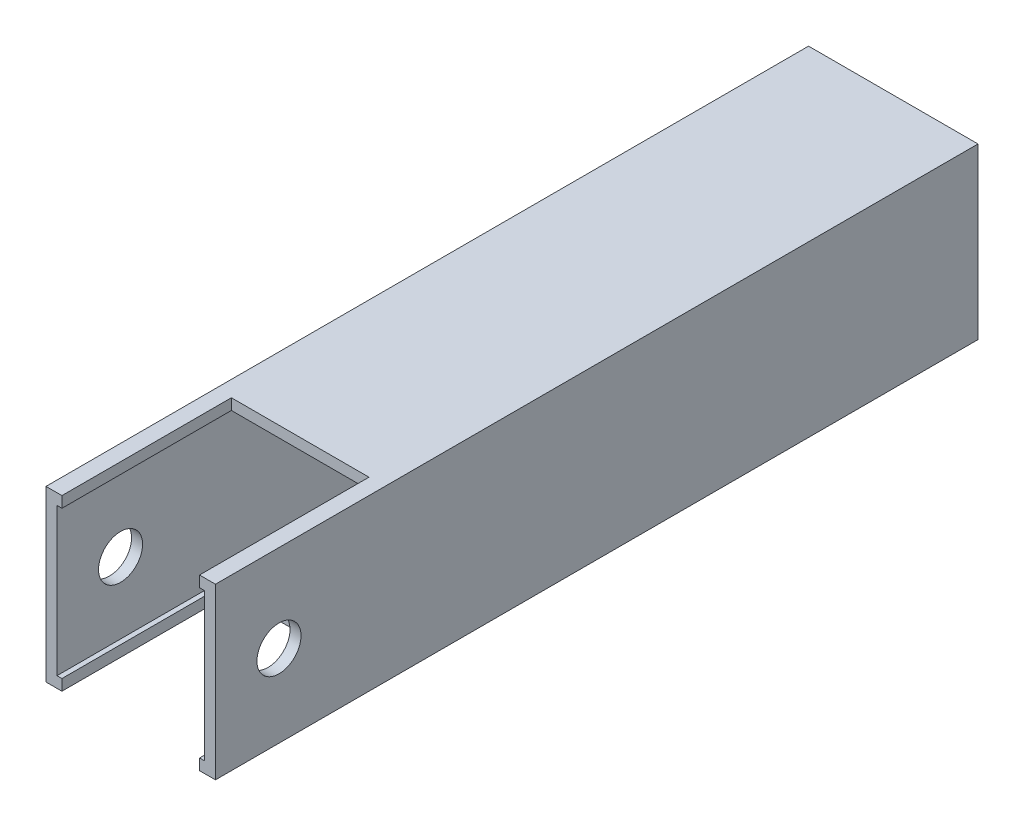
ISO-10303-21;
HEADER;
FILE_DESCRIPTION(('STEP AP214'),'2;1');
FILE_NAME('part.step','',(''),(''),'','','');
FILE_SCHEMA(('AUTOMOTIVE_DESIGN { 1 0 10303 214 1 1 1 1 }'));
ENDSEC;
DATA;
#1=APPLICATION_CONTEXT('core data for automotive mechanical design processes');
#2=APPLICATION_PROTOCOL_DEFINITION('international standard','automotive_design',2000,#1);
#3=PRODUCT_CONTEXT('',#1,'mechanical');
#4=PRODUCT('Part','Part','',(#3));
#5=PRODUCT_RELATED_PRODUCT_CATEGORY('part','',(#4));
#6=PRODUCT_DEFINITION_FORMATION('','',#4);
#7=PRODUCT_DEFINITION_CONTEXT('part definition',#1,'design');
#8=PRODUCT_DEFINITION('design','',#6,#7);
#9=PRODUCT_DEFINITION_SHAPE('','',#8);
#10=(LENGTH_UNIT() NAMED_UNIT(*) SI_UNIT(.MILLI.,.METRE.));
#11=(NAMED_UNIT(*) PLANE_ANGLE_UNIT() SI_UNIT($,.RADIAN.));
#12=(NAMED_UNIT(*) SI_UNIT($,.STERADIAN.) SOLID_ANGLE_UNIT());
#13=UNCERTAINTY_MEASURE_WITH_UNIT(LENGTH_MEASURE(1.E-05),#10,'distance_accuracy_value','');
#14=(GEOMETRIC_REPRESENTATION_CONTEXT(3) GLOBAL_UNCERTAINTY_ASSIGNED_CONTEXT((#13)) GLOBAL_UNIT_ASSIGNED_CONTEXT((#10,
#11,#12)) REPRESENTATION_CONTEXT('',''));
#15=CARTESIAN_POINT('',(0.,0.,0.));
#16=DIRECTION('',(0.,0.,1.));
#17=DIRECTION('',(1.,0.,0.));
#18=AXIS2_PLACEMENT_3D('',#15,#16,#17);
#19=CARTESIAN_POINT('',(0.,0.,114.3));
#20=DIRECTION('',(0.,0.,-1.));
#21=DIRECTION('',(-1.,0.,0.));
#22=AXIS2_PLACEMENT_3D('',#19,#20,#21);
#23=PLANE('',#22);
#24=DIRECTION('',(0.,-1.,0.));
#25=VECTOR('',#24,1.);
#26=CARTESIAN_POINT('',(-48.8937636693543,0.,114.3));
#27=LINE('',#26,#25);
#28=CARTESIAN_POINT('',(-48.8937636693543,-5.95052836207922,114.3));
#29=VERTEX_POINT('',#28);
#30=CARTESIAN_POINT('',(-48.8937636693543,-7.60152836207922,114.3));
#31=VERTEX_POINT('',#30);
#32=EDGE_CURVE('E56',#29,#31,#27,.T.);
#33=ORIENTED_EDGE('',*,*,#32,.F.);
#34=DIRECTION('',(-1.,0.,0.));
#35=VECTOR('',#34,1.);
#36=CARTESIAN_POINT('',(-51.2813636693543,-5.95052836207922,114.3));
#37=LINE('',#36,#35);
#38=CARTESIAN_POINT('',(-51.2813636693543,-5.95052836207922,114.3));
#39=VERTEX_POINT('',#38);
#40=EDGE_CURVE('E241',#29,#39,#37,.T.);
#41=ORIENTED_EDGE('',*,*,#40,.T.);
#42=DIRECTION('',(0.,-1.,0.));
#43=VECTOR('',#42,1.);
#44=CARTESIAN_POINT('',(-51.2813636693543,-31.3505283620792,114.3));
#45=LINE('',#44,#43);
#46=CARTESIAN_POINT('',(-51.2813636693543,-31.3505283620792,114.3));
#47=VERTEX_POINT('',#46);
#48=EDGE_CURVE('E232',#39,#47,#45,.T.);
#49=ORIENTED_EDGE('',*,*,#48,.T.);
#50=DIRECTION('',(1.,0.,0.));
#51=VECTOR('',#50,1.);
#52=CARTESIAN_POINT('',(-51.2813636693543,-31.3505283620792,114.3));
#53=LINE('',#52,#51);
#54=CARTESIAN_POINT('',(-48.8937636693543,-31.3505283620792,114.3));
#55=VERTEX_POINT('',#54);
#56=EDGE_CURVE('E236',#47,#55,#53,.T.);
#57=ORIENTED_EDGE('',*,*,#56,.T.);
#58=CARTESIAN_POINT('',(-48.8937636693543,-29.6995283620792,114.3));
#59=VERTEX_POINT('',#58);
#60=EDGE_CURVE('E186',#59,#55,#27,.T.);
#61=ORIENTED_EDGE('',*,*,#60,.F.);
#62=DIRECTION('',(1.,0.,0.));
#63=VECTOR('',#62,1.);
#64=CARTESIAN_POINT('',(-49.6303636693543,-29.6995283620792,114.3));
#65=LINE('',#64,#63);
#66=CARTESIAN_POINT('',(-49.6303636693543,-29.6995283620792,114.3));
#67=VERTEX_POINT('',#66);
#68=EDGE_CURVE('E200',#67,#59,#65,.T.);
#69=ORIENTED_EDGE('',*,*,#68,.F.);
#70=DIRECTION('',(0.,-1.,0.));
#71=VECTOR('',#70,1.);
#72=CARTESIAN_POINT('',(-49.6303636693543,-7.60152836207922,114.3));
#73=LINE('',#72,#71);
#74=CARTESIAN_POINT('',(-49.6303636693543,-7.60152836207922,114.3));
#75=VERTEX_POINT('',#74);
#76=EDGE_CURVE('E215',#75,#67,#73,.T.);
#77=ORIENTED_EDGE('',*,*,#76,.F.);
#78=DIRECTION('',(-1.,0.,0.));
#79=VECTOR('',#78,1.);
#80=CARTESIAN_POINT('',(-49.6303636693543,-7.60152836207922,114.3));
#81=LINE('',#80,#79);
#82=EDGE_CURVE('E211',#31,#75,#81,.T.);
#83=ORIENTED_EDGE('',*,*,#82,.F.);
#84=EDGE_LOOP('',(#33,#41,#49,#57,#61,#69,#77,#83));
#85=FACE_BOUND('',#84,.T.);
#86=ADVANCED_FACE('F32',(#85),#23,.F.);
#87=CARTESIAN_POINT('',(-51.2813636693543,-31.3505283620792,114.3));
#88=DIRECTION('',(1.,0.,0.));
#89=DIRECTION('',(0.,0.,-1.));
#90=AXIS2_PLACEMENT_3D('',#87,#88,#89);
#91=PLANE('',#90);
#92=CARTESIAN_POINT('',(-51.2813636693543,-19.0445855896719,104.775));
#93=DIRECTION('',(-1.,0.,0.));
#94=DIRECTION('',(0.,0.,1.));
#95=AXIS2_PLACEMENT_3D('',#92,#93,#94);
#96=CIRCLE('',#95,3.302);
#97=CARTESIAN_POINT('',(-51.2813636693543,-19.0445855896719,108.077));
#98=VERTEX_POINT('',#97);
#99=EDGE_CURVE('E410',#98,#98,#96,.T.);
#100=ORIENTED_EDGE('',*,*,#99,.F.);
#101=EDGE_LOOP('',(#100));
#102=FACE_BOUND('',#101,.T.);
#103=DIRECTION('',(0.,-1.,0.));
#104=VECTOR('',#103,1.);
#105=CARTESIAN_POINT('',(-51.2813636693543,-31.3505283620792,0.));
#106=LINE('',#105,#104);
#107=CARTESIAN_POINT('',(-51.2813636693543,-5.95052836207922,0.));
#108=VERTEX_POINT('',#107);
#109=CARTESIAN_POINT('',(-51.2813636693543,-31.3505283620792,0.));
#110=VERTEX_POINT('',#109);
#111=EDGE_CURVE('E224',#108,#110,#106,.T.);
#112=ORIENTED_EDGE('',*,*,#111,.T.);
#113=DIRECTION('',(0.,0.,-1.));
#114=VECTOR('',#113,1.);
#115=CARTESIAN_POINT('',(-51.2813636693543,-31.3505283620792,114.3));
#116=LINE('',#115,#114);
#117=EDGE_CURVE('E261',#47,#110,#116,.T.);
#118=ORIENTED_EDGE('',*,*,#117,.F.);
#119=ORIENTED_EDGE('',*,*,#48,.F.);
#120=DIRECTION('',(0.,0.,-1.));
#121=VECTOR('',#120,1.);
#122=CARTESIAN_POINT('',(-51.2813636693543,-5.95052836207922,114.3));
#123=LINE('',#122,#121);
#124=EDGE_CURVE('E245',#39,#108,#123,.T.);
#125=ORIENTED_EDGE('',*,*,#124,.T.);
#126=EDGE_LOOP('',(#112,#118,#119,#125));
#127=FACE_BOUND('',#126,.T.);
#128=ADVANCED_FACE('F34',(#102,#127),#91,.F.);
#129=CARTESIAN_POINT('',(-51.2813636693543,-31.3505283620792,114.3));
#130=DIRECTION('',(0.,1.,0.));
#131=DIRECTION('',(0.,0.,1.));
#132=AXIS2_PLACEMENT_3D('',#129,#130,#131);
#133=PLANE('',#132);
#134=CARTESIAN_POINT('',(-28.2689636693543,-31.3505283620792,114.3));
#135=VERTEX_POINT('',#134);
#136=CARTESIAN_POINT('',(-25.8813636693543,-31.3505283620792,114.3));
#137=VERTEX_POINT('',#136);
#138=EDGE_CURVE('E167',#135,#137,#53,.T.);
#139=ORIENTED_EDGE('',*,*,#138,.F.);
#140=DIRECTION('',(0.,0.,-1.));
#141=VECTOR('',#140,1.);
#142=CARTESIAN_POINT('',(-28.2689636693543,-31.3505283620792,139.7));
#143=LINE('',#142,#141);
#144=CARTESIAN_POINT('',(-28.2689636693543,-31.3505283620792,88.9));
#145=VERTEX_POINT('',#144);
#146=EDGE_CURVE('E154',#135,#145,#143,.T.);
#147=ORIENTED_EDGE('',*,*,#146,.T.);
#148=DIRECTION('',(1.,0.,0.));
#149=VECTOR('',#148,1.);
#150=CARTESIAN_POINT('',(-48.8937636693543,-31.3505283620792,88.9));
#151=LINE('',#150,#149);
#152=CARTESIAN_POINT('',(-48.8937636693543,-31.3505283620792,88.9));
#153=VERTEX_POINT('',#152);
#154=EDGE_CURVE('E146',#153,#145,#151,.T.);
#155=ORIENTED_EDGE('',*,*,#154,.F.);
#156=DIRECTION('',(0.,0.,-1.));
#157=VECTOR('',#156,1.);
#158=CARTESIAN_POINT('',(-48.8937636693543,-31.3505283620792,139.7));
#159=LINE('',#158,#157);
#160=EDGE_CURVE('E168',#55,#153,#159,.T.);
#161=ORIENTED_EDGE('',*,*,#160,.F.);
#162=ORIENTED_EDGE('',*,*,#56,.F.);
#163=ORIENTED_EDGE('',*,*,#117,.T.);
#164=DIRECTION('',(1.,0.,0.));
#165=VECTOR('',#164,1.);
#166=CARTESIAN_POINT('',(-51.2813636693543,-31.3505283620792,0.));
#167=LINE('',#166,#165);
#168=CARTESIAN_POINT('',(-25.8813636693543,-31.3505283620792,0.));
#169=VERTEX_POINT('',#168);
#170=EDGE_CURVE('E248',#110,#169,#167,.T.);
#171=ORIENTED_EDGE('',*,*,#170,.T.);
#172=DIRECTION('',(0.,0.,-1.));
#173=VECTOR('',#172,1.);
#174=CARTESIAN_POINT('',(-25.8813636693543,-31.3505283620792,114.3));
#175=LINE('',#174,#173);
#176=EDGE_CURVE('E258',#137,#169,#175,.T.);
#177=ORIENTED_EDGE('',*,*,#176,.F.);
#178=EDGE_LOOP('',(#139,#147,#155,#161,#162,#163,#171,#177));
#179=FACE_BOUND('',#178,.T.);
#180=ADVANCED_FACE('F165',(#179),#133,.F.);
#181=CARTESIAN_POINT('',(-25.8813636693543,-31.3505283620792,114.3));
#182=DIRECTION('',(-1.,0.,0.));
#183=DIRECTION('',(0.,0.,1.));
#184=AXIS2_PLACEMENT_3D('',#181,#182,#183);
#185=PLANE('',#184);
#186=CARTESIAN_POINT('',(-25.8813636693543,-19.0445855896719,104.775));
#187=DIRECTION('',(-1.,0.,0.));
#188=DIRECTION('',(0.,0.,1.));
#189=AXIS2_PLACEMENT_3D('',#186,#187,#188);
#190=CIRCLE('',#189,3.302);
#191=CARTESIAN_POINT('',(-25.8813636693543,-19.0445855896719,108.077));
#192=VERTEX_POINT('',#191);
#193=EDGE_CURVE('E405',#192,#192,#190,.T.);
#194=ORIENTED_EDGE('',*,*,#193,.T.);
#195=EDGE_LOOP('',(#194));
#196=FACE_BOUND('',#195,.T.);
#197=DIRECTION('',(0.,1.,0.));
#198=VECTOR('',#197,1.);
#199=CARTESIAN_POINT('',(-25.8813636693543,-31.3505283620792,0.));
#200=LINE('',#199,#198);
#201=CARTESIAN_POINT('',(-25.8813636693543,-5.95052836207922,0.));
#202=VERTEX_POINT('',#201);
#203=EDGE_CURVE('E250',#169,#202,#200,.T.);
#204=ORIENTED_EDGE('',*,*,#203,.T.);
#205=DIRECTION('',(0.,0.,-1.));
#206=VECTOR('',#205,1.);
#207=CARTESIAN_POINT('',(-25.8813636693543,-5.95052836207922,114.3));
#208=LINE('',#207,#206);
#209=CARTESIAN_POINT('',(-25.8813636693543,-5.95052836207922,114.3));
#210=VERTEX_POINT('',#209);
#211=EDGE_CURVE('E255',#210,#202,#208,.T.);
#212=ORIENTED_EDGE('',*,*,#211,.F.);
#213=DIRECTION('',(0.,1.,0.));
#214=VECTOR('',#213,1.);
#215=CARTESIAN_POINT('',(-25.8813636693543,-31.3505283620792,114.3));
#216=LINE('',#215,#214);
#217=EDGE_CURVE('E239',#137,#210,#216,.T.);
#218=ORIENTED_EDGE('',*,*,#217,.F.);
#219=ORIENTED_EDGE('',*,*,#176,.T.);
#220=EDGE_LOOP('',(#204,#212,#218,#219));
#221=FACE_BOUND('',#220,.T.);
#222=ADVANCED_FACE('F309',(#196,#221),#185,.F.);
#223=CARTESIAN_POINT('',(-51.2813636693543,-5.95052836207922,114.3));
#224=DIRECTION('',(0.,-1.,0.));
#225=DIRECTION('',(0.,0.,-1.));
#226=AXIS2_PLACEMENT_3D('',#223,#224,#225);
#227=PLANE('',#226);
#228=DIRECTION('',(1.,0.,0.));
#229=VECTOR('',#228,1.);
#230=CARTESIAN_POINT('',(-48.8937636693543,-5.95052836207922,88.9));
#231=LINE('',#230,#229);
#232=CARTESIAN_POINT('',(-48.8937636693543,-5.95052836207922,88.9));
#233=VERTEX_POINT('',#232);
#234=CARTESIAN_POINT('',(-28.2689636693543,-5.95052836207922,88.9));
#235=VERTEX_POINT('',#234);
#236=EDGE_CURVE('E174',#233,#235,#231,.T.);
#237=ORIENTED_EDGE('',*,*,#236,.T.);
#238=DIRECTION('',(0.,0.,-1.));
#239=VECTOR('',#238,1.);
#240=CARTESIAN_POINT('',(-28.2689636693543,-5.95052836207922,139.7));
#241=LINE('',#240,#239);
#242=CARTESIAN_POINT('',(-28.2689636693543,-5.95052836207922,114.3));
#243=VERTEX_POINT('',#242);
#244=EDGE_CURVE('E177',#243,#235,#241,.T.);
#245=ORIENTED_EDGE('',*,*,#244,.F.);
#246=EDGE_CURVE('E242',#210,#243,#37,.T.);
#247=ORIENTED_EDGE('',*,*,#246,.F.);
#248=ORIENTED_EDGE('',*,*,#211,.T.);
#249=DIRECTION('',(-1.,0.,0.));
#250=VECTOR('',#249,1.);
#251=CARTESIAN_POINT('',(-51.2813636693543,-5.95052836207922,0.));
#252=LINE('',#251,#250);
#253=EDGE_CURVE('E235',#202,#108,#252,.T.);
#254=ORIENTED_EDGE('',*,*,#253,.T.);
#255=ORIENTED_EDGE('',*,*,#124,.F.);
#256=ORIENTED_EDGE('',*,*,#40,.F.);
#257=DIRECTION('',(0.,0.,-1.));
#258=VECTOR('',#257,1.);
#259=CARTESIAN_POINT('',(-48.8937636693543,-5.95052836207922,139.7));
#260=LINE('',#259,#258);
#261=EDGE_CURVE('E155',#29,#233,#260,.T.);
#262=ORIENTED_EDGE('',*,*,#261,.T.);
#263=EDGE_LOOP('',(#237,#245,#247,#248,#254,#255,#256,#262));
#264=FACE_BOUND('',#263,.T.);
#265=ADVANCED_FACE('F285',(#264),#227,.F.);
#266=ORIENTED_EDGE('',*,*,#246,.T.);
#267=DIRECTION('',(0.,-1.,0.));
#268=VECTOR('',#267,1.);
#269=CARTESIAN_POINT('',(-28.2689636693543,0.,114.3));
#270=LINE('',#269,#268);
#271=CARTESIAN_POINT('',(-28.2689636693543,-7.60152836207922,114.3));
#272=VERTEX_POINT('',#271);
#273=EDGE_CURVE('E188',#243,#272,#270,.T.);
#274=ORIENTED_EDGE('',*,*,#273,.T.);
#275=CARTESIAN_POINT('',(-27.5323636693543,-7.60152836207922,114.3));
#276=VERTEX_POINT('',#275);
#277=EDGE_CURVE('E212',#276,#272,#81,.T.);
#278=ORIENTED_EDGE('',*,*,#277,.F.);
#279=DIRECTION('',(0.,1.,0.));
#280=VECTOR('',#279,1.);
#281=CARTESIAN_POINT('',(-27.5323636693543,-7.60152836207922,114.3));
#282=LINE('',#281,#280);
#283=CARTESIAN_POINT('',(-27.5323636693543,-29.6995283620792,114.3));
#284=VERTEX_POINT('',#283);
#285=EDGE_CURVE('E195',#284,#276,#282,.T.);
#286=ORIENTED_EDGE('',*,*,#285,.F.);
#287=CARTESIAN_POINT('',(-28.2689636693543,-29.6995283620792,114.3));
#288=VERTEX_POINT('',#287);
#289=EDGE_CURVE('E218',#288,#284,#65,.T.);
#290=ORIENTED_EDGE('',*,*,#289,.F.);
#291=EDGE_CURVE('E191',#288,#135,#270,.T.);
#292=ORIENTED_EDGE('',*,*,#291,.T.);
#293=ORIENTED_EDGE('',*,*,#138,.T.);
#294=ORIENTED_EDGE('',*,*,#217,.T.);
#295=EDGE_LOOP('',(#266,#274,#278,#286,#290,#292,#293,#294));
#296=FACE_BOUND('',#295,.T.);
#297=ADVANCED_FACE('F281',(#296),#23,.F.);
#298=CARTESIAN_POINT('',(0.,0.,0.));
#299=DIRECTION('',(0.,0.,-1.));
#300=DIRECTION('',(-1.,0.,0.));
#301=AXIS2_PLACEMENT_3D('',#298,#299,#300);
#302=PLANE('',#301);
#303=DIRECTION('',(0.,1.,0.));
#304=VECTOR('',#303,1.);
#305=CARTESIAN_POINT('',(-27.5323636693543,-7.60152836207922,0.));
#306=LINE('',#305,#304);
#307=CARTESIAN_POINT('',(-27.5323636693543,-29.6995283620792,0.));
#308=VERTEX_POINT('',#307);
#309=CARTESIAN_POINT('',(-27.5323636693543,-7.60152836207922,0.));
#310=VERTEX_POINT('',#309);
#311=EDGE_CURVE('E196',#308,#310,#306,.T.);
#312=ORIENTED_EDGE('',*,*,#311,.T.);
#313=DIRECTION('',(-1.,0.,0.));
#314=VECTOR('',#313,1.);
#315=CARTESIAN_POINT('',(-49.6303636693543,-7.60152836207922,0.));
#316=LINE('',#315,#314);
#317=CARTESIAN_POINT('',(-49.6303636693543,-7.60152836207922,0.));
#318=VERTEX_POINT('',#317);
#319=EDGE_CURVE('E199',#310,#318,#316,.T.);
#320=ORIENTED_EDGE('',*,*,#319,.T.);
#321=DIRECTION('',(0.,-1.,0.));
#322=VECTOR('',#321,1.);
#323=CARTESIAN_POINT('',(-49.6303636693543,-7.60152836207922,0.));
#324=LINE('',#323,#322);
#325=CARTESIAN_POINT('',(-49.6303636693543,-29.6995283620792,0.));
#326=VERTEX_POINT('',#325);
#327=EDGE_CURVE('E203',#318,#326,#324,.T.);
#328=ORIENTED_EDGE('',*,*,#327,.T.);
#329=DIRECTION('',(1.,0.,0.));
#330=VECTOR('',#329,1.);
#331=CARTESIAN_POINT('',(-49.6303636693543,-29.6995283620792,0.));
#332=LINE('',#331,#330);
#333=EDGE_CURVE('E206',#326,#308,#332,.T.);
#334=ORIENTED_EDGE('',*,*,#333,.T.);
#335=EDGE_LOOP('',(#312,#320,#328,#334));
#336=FACE_BOUND('',#335,.T.);
#337=ORIENTED_EDGE('',*,*,#111,.F.);
#338=ORIENTED_EDGE('',*,*,#253,.F.);
#339=ORIENTED_EDGE('',*,*,#203,.F.);
#340=ORIENTED_EDGE('',*,*,#170,.F.);
#341=EDGE_LOOP('',(#337,#338,#339,#340));
#342=FACE_BOUND('',#341,.T.);
#343=ADVANCED_FACE('F298',(#336,#342),#302,.T.);
#344=CARTESIAN_POINT('',(-27.5323636693543,-7.60152836207922,0.));
#345=DIRECTION('',(1.,0.,0.));
#346=DIRECTION('',(0.,1.,0.));
#347=AXIS2_PLACEMENT_3D('',#344,#345,#346);
#348=PLANE('',#347);
#349=CARTESIAN_POINT('',(-27.5323636693543,-19.0445855896719,104.775));
#350=DIRECTION('',(1.,0.,0.));
#351=DIRECTION('',(0.,1.,0.));
#352=AXIS2_PLACEMENT_3D('',#349,#350,#351);
#353=CIRCLE('',#352,3.302);
#354=CARTESIAN_POINT('',(-27.5323636693543,-15.7425855896719,104.775));
#355=VERTEX_POINT('',#354);
#356=EDGE_CURVE('E178',#355,#355,#353,.T.);
#357=ORIENTED_EDGE('',*,*,#356,.T.);
#358=EDGE_LOOP('',(#357));
#359=FACE_BOUND('',#358,.T.);
#360=ORIENTED_EDGE('',*,*,#285,.T.);
#361=DIRECTION('',(0.,0.,1.));
#362=VECTOR('',#361,1.);
#363=CARTESIAN_POINT('',(-27.5323636693543,-7.60152836207922,0.));
#364=LINE('',#363,#362);
#365=EDGE_CURVE('E209',#310,#276,#364,.T.);
#366=ORIENTED_EDGE('',*,*,#365,.F.);
#367=ORIENTED_EDGE('',*,*,#311,.F.);
#368=DIRECTION('',(0.,0.,1.));
#369=VECTOR('',#368,1.);
#370=CARTESIAN_POINT('',(-27.5323636693543,-29.6995283620792,0.));
#371=LINE('',#370,#369);
#372=EDGE_CURVE('E221',#308,#284,#371,.T.);
#373=ORIENTED_EDGE('',*,*,#372,.T.);
#374=EDGE_LOOP('',(#360,#366,#367,#373));
#375=FACE_BOUND('',#374,.T.);
#376=ADVANCED_FACE('F302',(#359,#375),#348,.F.);
#377=CARTESIAN_POINT('',(-49.6303636693543,-29.6995283620792,0.));
#378=DIRECTION('',(0.,-1.,0.));
#379=DIRECTION('',(0.,0.,-1.));
#380=AXIS2_PLACEMENT_3D('',#377,#378,#379);
#381=PLANE('',#380);
#382=DIRECTION('',(-1.,0.,0.));
#383=VECTOR('',#382,1.);
#384=CARTESIAN_POINT('',(-49.6303636693543,-29.6995283620792,88.9));
#385=LINE('',#384,#383);
#386=CARTESIAN_POINT('',(-28.2689636693543,-29.6995283620792,88.9));
#387=VERTEX_POINT('',#386);
#388=CARTESIAN_POINT('',(-48.8937636693543,-29.6995283620792,88.9));
#389=VERTEX_POINT('',#388);
#390=EDGE_CURVE('E193',#387,#389,#385,.T.);
#391=ORIENTED_EDGE('',*,*,#390,.F.);
#392=DIRECTION('',(0.,0.,1.));
#393=VECTOR('',#392,1.);
#394=CARTESIAN_POINT('',(-28.2689636693543,-29.6995283620792,0.));
#395=LINE('',#394,#393);
#396=EDGE_CURVE('E161',#387,#288,#395,.T.);
#397=ORIENTED_EDGE('',*,*,#396,.T.);
#398=ORIENTED_EDGE('',*,*,#289,.T.);
#399=ORIENTED_EDGE('',*,*,#372,.F.);
#400=ORIENTED_EDGE('',*,*,#333,.F.);
#401=DIRECTION('',(0.,0.,1.));
#402=VECTOR('',#401,1.);
#403=CARTESIAN_POINT('',(-49.6303636693543,-29.6995283620792,0.));
#404=LINE('',#403,#402);
#405=EDGE_CURVE('E225',#326,#67,#404,.T.);
#406=ORIENTED_EDGE('',*,*,#405,.T.);
#407=ORIENTED_EDGE('',*,*,#68,.T.);
#408=DIRECTION('',(0.,0.,1.));
#409=VECTOR('',#408,1.);
#410=CARTESIAN_POINT('',(-48.8937636693543,-29.6995283620792,0.));
#411=LINE('',#410,#409);
#412=EDGE_CURVE('E185',#389,#59,#411,.T.);
#413=ORIENTED_EDGE('',*,*,#412,.F.);
#414=EDGE_LOOP('',(#391,#397,#398,#399,#400,#406,#407,#413));
#415=FACE_BOUND('',#414,.T.);
#416=ADVANCED_FACE('F304',(#415),#381,.F.);
#417=CARTESIAN_POINT('',(-49.6303636693543,-7.60152836207922,0.));
#418=DIRECTION('',(-1.,0.,0.));
#419=DIRECTION('',(0.,0.,1.));
#420=AXIS2_PLACEMENT_3D('',#417,#418,#419);
#421=PLANE('',#420);
#422=CARTESIAN_POINT('',(-49.6303636693543,-19.0445855896719,104.775));
#423=DIRECTION('',(-1.,0.,0.));
#424=DIRECTION('',(0.,0.,1.));
#425=AXIS2_PLACEMENT_3D('',#422,#423,#424);
#426=CIRCLE('',#425,3.302);
#427=CARTESIAN_POINT('',(-49.6303636693543,-19.0445855896719,108.077));
#428=VERTEX_POINT('',#427);
#429=EDGE_CURVE('E36',#428,#428,#426,.T.);
#430=ORIENTED_EDGE('',*,*,#429,.T.);
#431=EDGE_LOOP('',(#430));
#432=FACE_BOUND('',#431,.T.);
#433=ORIENTED_EDGE('',*,*,#76,.T.);
#434=ORIENTED_EDGE('',*,*,#405,.F.);
#435=ORIENTED_EDGE('',*,*,#327,.F.);
#436=DIRECTION('',(0.,0.,1.));
#437=VECTOR('',#436,1.);
#438=CARTESIAN_POINT('',(-49.6303636693543,-7.60152836207922,0.));
#439=LINE('',#438,#437);
#440=EDGE_CURVE('E227',#318,#75,#439,.T.);
#441=ORIENTED_EDGE('',*,*,#440,.T.);
#442=EDGE_LOOP('',(#433,#434,#435,#441));
#443=FACE_BOUND('',#442,.T.);
#444=ADVANCED_FACE('F295',(#432,#443),#421,.F.);
#445=CARTESIAN_POINT('',(-49.6303636693543,-7.60152836207922,0.));
#446=DIRECTION('',(0.,1.,0.));
#447=DIRECTION('',(0.,0.,1.));
#448=AXIS2_PLACEMENT_3D('',#445,#446,#447);
#449=PLANE('',#448);
#450=ORIENTED_EDGE('',*,*,#277,.T.);
#451=DIRECTION('',(0.,0.,-1.));
#452=VECTOR('',#451,1.);
#453=CARTESIAN_POINT('',(-28.2689636693543,-7.60152836207922,0.));
#454=LINE('',#453,#452);
#455=CARTESIAN_POINT('',(-28.2689636693543,-7.60152836207922,88.9));
#456=VERTEX_POINT('',#455);
#457=EDGE_CURVE('E11',#272,#456,#454,.T.);
#458=ORIENTED_EDGE('',*,*,#457,.T.);
#459=DIRECTION('',(1.,0.,0.));
#460=VECTOR('',#459,1.);
#461=CARTESIAN_POINT('',(-49.6303636693543,-7.60152836207922,88.9));
#462=LINE('',#461,#460);
#463=CARTESIAN_POINT('',(-48.8937636693543,-7.60152836207922,88.9));
#464=VERTEX_POINT('',#463);
#465=EDGE_CURVE('E41',#464,#456,#462,.T.);
#466=ORIENTED_EDGE('',*,*,#465,.F.);
#467=DIRECTION('',(0.,0.,-1.));
#468=VECTOR('',#467,1.);
#469=CARTESIAN_POINT('',(-48.8937636693543,-7.60152836207922,0.));
#470=LINE('',#469,#468);
#471=EDGE_CURVE('E264',#31,#464,#470,.T.);
#472=ORIENTED_EDGE('',*,*,#471,.F.);
#473=ORIENTED_EDGE('',*,*,#82,.T.);
#474=ORIENTED_EDGE('',*,*,#440,.F.);
#475=ORIENTED_EDGE('',*,*,#319,.F.);
#476=ORIENTED_EDGE('',*,*,#365,.T.);
#477=EDGE_LOOP('',(#450,#458,#466,#472,#473,#474,#475,#476));
#478=FACE_BOUND('',#477,.T.);
#479=ADVANCED_FACE('F276',(#478),#449,.F.);
#480=CARTESIAN_POINT('',(-28.2689636693543,-31.3505283620792,139.7));
#481=DIRECTION('',(1.,0.,0.));
#482=DIRECTION('',(0.,0.,-1.));
#483=AXIS2_PLACEMENT_3D('',#480,#481,#482);
#484=PLANE('',#483);
#485=ORIENTED_EDGE('',*,*,#244,.T.);
#486=DIRECTION('',(0.,1.,0.));
#487=VECTOR('',#486,1.);
#488=CARTESIAN_POINT('',(-28.2689636693543,-31.3505283620792,88.9));
#489=LINE('',#488,#487);
#490=EDGE_CURVE('E162',#456,#235,#489,.T.);
#491=ORIENTED_EDGE('',*,*,#490,.F.);
#492=ORIENTED_EDGE('',*,*,#457,.F.);
#493=ORIENTED_EDGE('',*,*,#273,.F.);
#494=EDGE_LOOP('',(#485,#491,#492,#493));
#495=FACE_BOUND('',#494,.T.);
#496=ADVANCED_FACE('F274',(#495),#484,.F.);
#497=CARTESIAN_POINT('',(-48.8937636693543,-31.3505283620792,139.7));
#498=DIRECTION('',(1.,0.,0.));
#499=DIRECTION('',(0.,0.,-1.));
#500=AXIS2_PLACEMENT_3D('',#497,#498,#499);
#501=PLANE('',#500);
#502=ORIENTED_EDGE('',*,*,#32,.T.);
#503=ORIENTED_EDGE('',*,*,#471,.T.);
#504=DIRECTION('',(0.,1.,0.));
#505=VECTOR('',#504,1.);
#506=CARTESIAN_POINT('',(-48.8937636693543,-31.3505283620792,88.9));
#507=LINE('',#506,#505);
#508=EDGE_CURVE('E170',#464,#233,#507,.T.);
#509=ORIENTED_EDGE('',*,*,#508,.T.);
#510=ORIENTED_EDGE('',*,*,#261,.F.);
#511=EDGE_LOOP('',(#502,#503,#509,#510));
#512=FACE_BOUND('',#511,.T.);
#513=ADVANCED_FACE('F288',(#512),#501,.T.);
#514=CARTESIAN_POINT('',(-48.8937636693543,-31.3505283620792,88.9));
#515=DIRECTION('',(0.,0.,1.));
#516=DIRECTION('',(1.,0.,0.));
#517=AXIS2_PLACEMENT_3D('',#514,#515,#516);
#518=PLANE('',#517);
#519=ORIENTED_EDGE('',*,*,#465,.T.);
#520=ORIENTED_EDGE('',*,*,#490,.T.);
#521=ORIENTED_EDGE('',*,*,#236,.F.);
#522=ORIENTED_EDGE('',*,*,#508,.F.);
#523=EDGE_LOOP('',(#519,#520,#521,#522));
#524=FACE_BOUND('',#523,.T.);
#525=ADVANCED_FACE('F270',(#524),#518,.T.);
#526=ORIENTED_EDGE('',*,*,#390,.T.);
#527=EDGE_CURVE('E48',#153,#389,#507,.T.);
#528=ORIENTED_EDGE('',*,*,#527,.F.);
#529=ORIENTED_EDGE('',*,*,#154,.T.);
#530=EDGE_CURVE('E149',#145,#387,#489,.T.);
#531=ORIENTED_EDGE('',*,*,#530,.T.);
#532=EDGE_LOOP('',(#526,#528,#529,#531));
#533=FACE_BOUND('',#532,.T.);
#534=ADVANCED_FACE('F148',(#533),#518,.T.);
#535=ORIENTED_EDGE('',*,*,#396,.F.);
#536=ORIENTED_EDGE('',*,*,#530,.F.);
#537=ORIENTED_EDGE('',*,*,#146,.F.);
#538=ORIENTED_EDGE('',*,*,#291,.F.);
#539=EDGE_LOOP('',(#535,#536,#537,#538));
#540=FACE_BOUND('',#539,.T.);
#541=ADVANCED_FACE('F158',(#540),#484,.F.);
#542=ORIENTED_EDGE('',*,*,#60,.T.);
#543=ORIENTED_EDGE('',*,*,#160,.T.);
#544=ORIENTED_EDGE('',*,*,#527,.T.);
#545=ORIENTED_EDGE('',*,*,#412,.T.);
#546=EDGE_LOOP('',(#542,#543,#544,#545));
#547=FACE_BOUND('',#546,.T.);
#548=ADVANCED_FACE('F316',(#547),#501,.T.);
#549=CARTESIAN_POINT('',(-25.8813636693543,-19.0445855896719,104.775));
#550=DIRECTION('',(-1.,0.,0.));
#551=DIRECTION('',(0.,0.,1.));
#552=AXIS2_PLACEMENT_3D('',#549,#550,#551);
#553=CYLINDRICAL_SURFACE('',#552,3.302);
#554=ORIENTED_EDGE('',*,*,#99,.T.);
#555=EDGE_LOOP('',(#554));
#556=FACE_BOUND('',#555,.T.);
#557=ORIENTED_EDGE('',*,*,#429,.F.);
#558=EDGE_LOOP('',(#557));
#559=FACE_BOUND('',#558,.T.);
#560=ADVANCED_FACE('F319',(#556,#559),#553,.F.);
#561=ORIENTED_EDGE('',*,*,#193,.F.);
#562=EDGE_LOOP('',(#561));
#563=FACE_BOUND('',#562,.T.);
#564=ORIENTED_EDGE('',*,*,#356,.F.);
#565=EDGE_LOOP('',(#564));
#566=FACE_BOUND('',#565,.T.);
#567=ADVANCED_FACE('F325',(#563,#566),#553,.F.);
#568=CLOSED_SHELL('',(#86,#128,#180,#222,#265,#297,#343,#376,#416,#444,#479,#496,#513,#525,#534,
#541,#548,#560,#567));
#569=MANIFOLD_SOLID_BREP('B2',#568);
#570=ADVANCED_BREP_SHAPE_REPRESENTATION('',(#18,#569),#14);
#571=SHAPE_DEFINITION_REPRESENTATION(#9,#570);
ENDSEC;
END-ISO-10303-21;
